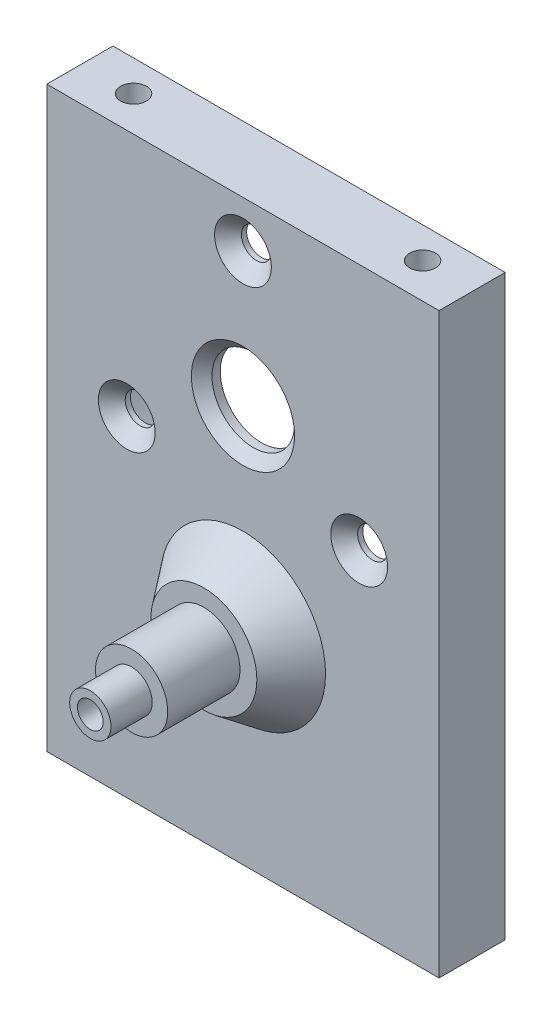
ISO-10303-21;
HEADER;
FILE_DESCRIPTION(('STEP AP214'),'2;1');
FILE_NAME('part.step','',(''),(''),'','','');
FILE_SCHEMA(('AUTOMOTIVE_DESIGN { 1 0 10303 214 1 1 1 1 }'));
ENDSEC;
DATA;
#1=APPLICATION_CONTEXT('core data for automotive mechanical design processes');
#2=APPLICATION_PROTOCOL_DEFINITION('international standard','automotive_design',2000,#1);
#3=PRODUCT_CONTEXT('',#1,'mechanical');
#4=PRODUCT('Part','Part','',(#3));
#5=PRODUCT_RELATED_PRODUCT_CATEGORY('part','',(#4));
#6=PRODUCT_DEFINITION_FORMATION('','',#4);
#7=PRODUCT_DEFINITION_CONTEXT('part definition',#1,'design');
#8=PRODUCT_DEFINITION('design','',#6,#7);
#9=PRODUCT_DEFINITION_SHAPE('','',#8);
#10=(LENGTH_UNIT() NAMED_UNIT(*) SI_UNIT(.MILLI.,.METRE.));
#11=(NAMED_UNIT(*) PLANE_ANGLE_UNIT() SI_UNIT($,.RADIAN.));
#12=(NAMED_UNIT(*) SI_UNIT($,.STERADIAN.) SOLID_ANGLE_UNIT());
#13=UNCERTAINTY_MEASURE_WITH_UNIT(LENGTH_MEASURE(1.E-05),#10,'distance_accuracy_value','');
#14=(GEOMETRIC_REPRESENTATION_CONTEXT(3) GLOBAL_UNCERTAINTY_ASSIGNED_CONTEXT((#13)) GLOBAL_UNIT_ASSIGNED_CONTEXT((#10,
#11,#12)) REPRESENTATION_CONTEXT('',''));
#15=CARTESIAN_POINT('',(0.,0.,0.));
#16=DIRECTION('',(0.,0.,1.));
#17=DIRECTION('',(1.,0.,0.));
#18=AXIS2_PLACEMENT_3D('',#15,#16,#17);
#19=CARTESIAN_POINT('',(0.,20.,17.19));
#20=DIRECTION('',(0.,0.,1.));
#21=DIRECTION('',(1.,0.,0.));
#22=AXIS2_PLACEMENT_3D('',#19,#20,#21);
#23=PLANE('',#22);
#24=CARTESIAN_POINT('',(0.,20.,17.19));
#25=DIRECTION('',(0.,0.,1.));
#26=DIRECTION('',(1.,0.,0.));
#27=AXIS2_PLACEMENT_3D('',#24,#25,#26);
#28=CIRCLE('',#27,3.5);
#29=CARTESIAN_POINT('',(3.5,20.,17.19));
#30=VERTEX_POINT('',#29);
#31=EDGE_CURVE('E118',#30,#30,#28,.T.);
#32=ORIENTED_EDGE('',*,*,#31,.T.);
#33=EDGE_LOOP('',(#32));
#34=FACE_BOUND('',#33,.T.);
#35=CARTESIAN_POINT('',(0.,20.,17.19));
#36=DIRECTION('',(0.,0.,1.));
#37=DIRECTION('',(1.,0.,0.));
#38=AXIS2_PLACEMENT_3D('',#35,#36,#37);
#39=CIRCLE('',#38,2.);
#40=CARTESIAN_POINT('',(2.,20.,17.19));
#41=VERTEX_POINT('',#40);
#42=EDGE_CURVE('E104',#41,#41,#39,.T.);
#43=ORIENTED_EDGE('',*,*,#42,.F.);
#44=EDGE_LOOP('',(#43));
#45=FACE_BOUND('',#44,.T.);
#46=ADVANCED_FACE('F41',(#34,#45),#23,.T.);
#47=CARTESIAN_POINT('',(0.,20.,10.19));
#48=DIRECTION('',(0.,0.,1.));
#49=DIRECTION('',(1.,0.,0.));
#50=AXIS2_PLACEMENT_3D('',#47,#48,#49);
#51=PLANE('',#50);
#52=CARTESIAN_POINT('',(0.,20.,10.19));
#53=DIRECTION('',(0.,0.,1.));
#54=DIRECTION('',(1.,0.,0.));
#55=AXIS2_PLACEMENT_3D('',#52,#53,#54);
#56=CIRCLE('',#55,5.13421550094521);
#57=CARTESIAN_POINT('',(5.13421550094521,20.,10.19));
#58=VERTEX_POINT('',#57);
#59=EDGE_CURVE('E183',#58,#58,#56,.T.);
#60=ORIENTED_EDGE('',*,*,#59,.T.);
#61=EDGE_LOOP('',(#60));
#62=FACE_BOUND('',#61,.T.);
#63=CARTESIAN_POINT('',(0.,20.,10.19));
#64=DIRECTION('',(0.,0.,1.));
#65=DIRECTION('',(1.,0.,0.));
#66=AXIS2_PLACEMENT_3D('',#63,#64,#65);
#67=CIRCLE('',#66,3.5);
#68=CARTESIAN_POINT('',(3.5,20.,10.19));
#69=VERTEX_POINT('',#68);
#70=EDGE_CURVE('E116',#69,#69,#67,.T.);
#71=ORIENTED_EDGE('',*,*,#70,.F.);
#72=EDGE_LOOP('',(#71));
#73=FACE_BOUND('',#72,.T.);
#74=ADVANCED_FACE('F204',(#62,#73),#51,.T.);
#75=CARTESIAN_POINT('',(0.,38.5,4.6));
#76=DIRECTION('',(0.,0.,-1.));
#77=DIRECTION('',(-1.,0.,0.));
#78=AXIS2_PLACEMENT_3D('',#75,#76,#77);
#79=PLANE('',#78);
#80=CARTESIAN_POINT('',(11.2583302491976,31.9999999999999,4.6));
#81=DIRECTION('',(0.,0.,-1.));
#82=DIRECTION('',(-1.,0.,0.));
#83=AXIS2_PLACEMENT_3D('',#80,#81,#82);
#84=CIRCLE('',#83,1.44999999999999);
#85=CARTESIAN_POINT('',(9.80833024919764,31.9999999999999,4.6));
#86=VERTEX_POINT('',#85);
#87=EDGE_CURVE('E137',#86,#86,#84,.F.);
#88=ORIENTED_EDGE('',*,*,#87,.T.);
#89=EDGE_LOOP('',(#88));
#90=FACE_BOUND('',#89,.T.);
#91=CARTESIAN_POINT('',(-11.2583302491978,32.,4.6));
#92=DIRECTION('',(0.,0.,-1.));
#93=DIRECTION('',(-1.,0.,0.));
#94=AXIS2_PLACEMENT_3D('',#91,#92,#93);
#95=CIRCLE('',#94,1.44999999999999);
#96=CARTESIAN_POINT('',(-12.7083302491978,32.,4.6));
#97=VERTEX_POINT('',#96);
#98=EDGE_CURVE('E146',#97,#97,#95,.F.);
#99=ORIENTED_EDGE('',*,*,#98,.T.);
#100=EDGE_LOOP('',(#99));
#101=FACE_BOUND('',#100,.T.);
#102=CARTESIAN_POINT('',(0.,38.5,4.6));
#103=DIRECTION('',(0.,0.,-1.));
#104=DIRECTION('',(-1.,0.,0.));
#105=AXIS2_PLACEMENT_3D('',#102,#103,#104);
#106=CIRCLE('',#105,4.00000000000001);
#107=CARTESIAN_POINT('',(-4.00000000000001,38.5,4.6));
#108=VERTEX_POINT('',#107);
#109=EDGE_CURVE('E145',#108,#108,#106,.T.);
#110=ORIENTED_EDGE('',*,*,#109,.F.);
#111=EDGE_LOOP('',(#110));
#112=FACE_BOUND('',#111,.T.);
#113=CARTESIAN_POINT('',(0.,38.5,4.6));
#114=DIRECTION('',(0.,0.,-1.));
#115=DIRECTION('',(-1.,0.,0.));
#116=AXIS2_PLACEMENT_3D('',#113,#114,#115);
#117=CIRCLE('',#116,16.54);
#118=CARTESIAN_POINT('',(-16.54,38.5,4.6));
#119=VERTEX_POINT('',#118);
#120=EDGE_CURVE('E154',#119,#119,#117,.T.);
#121=ORIENTED_EDGE('',*,*,#120,.T.);
#122=EDGE_LOOP('',(#121));
#123=FACE_BOUND('',#122,.T.);
#124=CARTESIAN_POINT('',(0.,51.5,4.6));
#125=DIRECTION('',(0.,0.,-1.));
#126=DIRECTION('',(-1.,0.,0.));
#127=AXIS2_PLACEMENT_3D('',#124,#125,#126);
#128=CIRCLE('',#127,1.44999999999999);
#129=CARTESIAN_POINT('',(-1.44999999999999,51.5,4.6));
#130=VERTEX_POINT('',#129);
#131=EDGE_CURVE('E128',#130,#130,#128,.F.);
#132=ORIENTED_EDGE('',*,*,#131,.T.);
#133=EDGE_LOOP('',(#132));
#134=FACE_BOUND('',#133,.T.);
#135=ADVANCED_FACE('F210',(#90,#101,#112,#123,#134),#79,.T.);
#136=CARTESIAN_POINT('',(19.,56.,6.4));
#137=DIRECTION('',(0.,0.,1.));
#138=DIRECTION('',(1.,0.,0.));
#139=AXIS2_PLACEMENT_3D('',#136,#137,#138);
#140=PLANE('',#139);
#141=CARTESIAN_POINT('',(0.,38.5,6.4));
#142=DIRECTION('',(0.,0.,1.));
#143=DIRECTION('',(1.,0.,0.));
#144=AXIS2_PLACEMENT_3D('',#141,#142,#143);
#145=CIRCLE('',#144,5.);
#146=CARTESIAN_POINT('',(5.,38.5,6.4));
#147=VERTEX_POINT('',#146);
#148=EDGE_CURVE('E50',#147,#147,#145,.F.);
#149=ORIENTED_EDGE('',*,*,#148,.T.);
#150=EDGE_LOOP('',(#149));
#151=FACE_BOUND('',#150,.T.);
#152=CARTESIAN_POINT('',(0.,20.,6.4));
#153=DIRECTION('',(0.,0.,1.));
#154=DIRECTION('',(1.,0.,0.));
#155=AXIS2_PLACEMENT_3D('',#152,#153,#154);
#156=CIRCLE('',#155,8.00000000000004);
#157=CARTESIAN_POINT('',(8.00000000000004,20.,6.4));
#158=VERTEX_POINT('',#157);
#159=EDGE_CURVE('E180',#158,#158,#156,.F.);
#160=ORIENTED_EDGE('',*,*,#159,.T.);
#161=EDGE_LOOP('',(#160));
#162=FACE_BOUND('',#161,.T.);
#163=CARTESIAN_POINT('',(0.,51.5,6.4));
#164=DIRECTION('',(0.,0.,1.));
#165=DIRECTION('',(1.,0.,0.));
#166=AXIS2_PLACEMENT_3D('',#163,#164,#165);
#167=CIRCLE('',#166,2.75);
#168=CARTESIAN_POINT('',(2.75,51.5,6.4));
#169=VERTEX_POINT('',#168);
#170=EDGE_CURVE('E121',#169,#169,#167,.T.);
#171=ORIENTED_EDGE('',*,*,#170,.F.);
#172=EDGE_LOOP('',(#171));
#173=FACE_BOUND('',#172,.T.);
#174=CARTESIAN_POINT('',(11.2583302491976,31.9999999999999,6.4));
#175=DIRECTION('',(0.,0.,1.));
#176=DIRECTION('',(1.,0.,0.));
#177=AXIS2_PLACEMENT_3D('',#174,#175,#176);
#178=CIRCLE('',#177,2.75);
#179=CARTESIAN_POINT('',(14.0083302491976,31.9999999999999,6.4));
#180=VERTEX_POINT('',#179);
#181=EDGE_CURVE('E127',#180,#180,#178,.T.);
#182=ORIENTED_EDGE('',*,*,#181,.F.);
#183=EDGE_LOOP('',(#182));
#184=FACE_BOUND('',#183,.T.);
#185=CARTESIAN_POINT('',(-11.2583302491978,32.,6.4));
#186=DIRECTION('',(0.,0.,1.));
#187=DIRECTION('',(1.,0.,0.));
#188=AXIS2_PLACEMENT_3D('',#185,#186,#187);
#189=CIRCLE('',#188,2.75);
#190=CARTESIAN_POINT('',(-8.50833024919783,32.,6.4));
#191=VERTEX_POINT('',#190);
#192=EDGE_CURVE('E136',#191,#191,#189,.T.);
#193=ORIENTED_EDGE('',*,*,#192,.F.);
#194=EDGE_LOOP('',(#193));
#195=FACE_BOUND('',#194,.T.);
#196=DIRECTION('',(0.,1.,0.));
#197=VECTOR('',#196,1.);
#198=CARTESIAN_POINT('',(19.,0.,6.4));
#199=LINE('',#198,#197);
#200=CARTESIAN_POINT('',(19.,0.,6.4));
#201=VERTEX_POINT('',#200);
#202=CARTESIAN_POINT('',(19.,56.,6.4));
#203=VERTEX_POINT('',#202);
#204=EDGE_CURVE('E160',#201,#203,#199,.T.);
#205=ORIENTED_EDGE('',*,*,#204,.T.);
#206=DIRECTION('',(-1.,0.,0.));
#207=VECTOR('',#206,1.);
#208=CARTESIAN_POINT('',(19.,56.,6.4));
#209=LINE('',#208,#207);
#210=CARTESIAN_POINT('',(-19.,56.,6.4));
#211=VERTEX_POINT('',#210);
#212=EDGE_CURVE('E90',#203,#211,#209,.T.);
#213=ORIENTED_EDGE('',*,*,#212,.T.);
#214=DIRECTION('',(0.,-1.,0.));
#215=VECTOR('',#214,1.);
#216=CARTESIAN_POINT('',(-19.,56.,6.4));
#217=LINE('',#216,#215);
#218=CARTESIAN_POINT('',(-19.,0.,6.4));
#219=VERTEX_POINT('',#218);
#220=EDGE_CURVE('E163',#211,#219,#217,.T.);
#221=ORIENTED_EDGE('',*,*,#220,.T.);
#222=DIRECTION('',(1.,0.,0.));
#223=VECTOR('',#222,1.);
#224=CARTESIAN_POINT('',(-19.,0.,6.4));
#225=LINE('',#224,#223);
#226=EDGE_CURVE('E58',#219,#201,#225,.T.);
#227=ORIENTED_EDGE('',*,*,#226,.T.);
#228=EDGE_LOOP('',(#205,#213,#221,#227));
#229=FACE_BOUND('',#228,.T.);
#230=ADVANCED_FACE('F188',(#151,#162,#173,#184,#195,#229),#140,.T.);
#231=CARTESIAN_POINT('',(19.,56.,0.));
#232=DIRECTION('',(0.,0.,1.));
#233=DIRECTION('',(1.,0.,0.));
#234=AXIS2_PLACEMENT_3D('',#231,#232,#233);
#235=PLANE('',#234);
#236=DIRECTION('',(0.,1.,0.));
#237=VECTOR('',#236,1.);
#238=CARTESIAN_POINT('',(19.,0.,0.));
#239=LINE('',#238,#237);
#240=CARTESIAN_POINT('',(19.,0.,0.));
#241=VERTEX_POINT('',#240);
#242=CARTESIAN_POINT('',(19.,56.,0.));
#243=VERTEX_POINT('',#242);
#244=EDGE_CURVE('E157',#241,#243,#239,.T.);
#245=ORIENTED_EDGE('',*,*,#244,.F.);
#246=DIRECTION('',(1.,0.,0.));
#247=VECTOR('',#246,1.);
#248=CARTESIAN_POINT('',(-19.,0.,0.));
#249=LINE('',#248,#247);
#250=CARTESIAN_POINT('',(-19.,0.,0.));
#251=VERTEX_POINT('',#250);
#252=EDGE_CURVE('E82',#251,#241,#249,.T.);
#253=ORIENTED_EDGE('',*,*,#252,.F.);
#254=DIRECTION('',(0.,-1.,0.));
#255=VECTOR('',#254,1.);
#256=CARTESIAN_POINT('',(-19.,56.,0.));
#257=LINE('',#256,#255);
#258=CARTESIAN_POINT('',(-19.,56.,0.));
#259=VERTEX_POINT('',#258);
#260=EDGE_CURVE('E76',#259,#251,#257,.T.);
#261=ORIENTED_EDGE('',*,*,#260,.F.);
#262=DIRECTION('',(-1.,0.,0.));
#263=VECTOR('',#262,1.);
#264=CARTESIAN_POINT('',(19.,56.,0.));
#265=LINE('',#264,#263);
#266=EDGE_CURVE('E169',#243,#259,#265,.T.);
#267=ORIENTED_EDGE('',*,*,#266,.F.);
#268=EDGE_LOOP('',(#245,#253,#261,#267));
#269=FACE_BOUND('',#268,.T.);
#270=CARTESIAN_POINT('',(0.,38.5,0.));
#271=DIRECTION('',(0.,0.,-1.));
#272=DIRECTION('',(-1.,0.,0.));
#273=AXIS2_PLACEMENT_3D('',#270,#271,#272);
#274=CIRCLE('',#273,16.54);
#275=CARTESIAN_POINT('',(-16.54,38.5,0.));
#276=VERTEX_POINT('',#275);
#277=EDGE_CURVE('E153',#276,#276,#274,.T.);
#278=ORIENTED_EDGE('',*,*,#277,.F.);
#279=EDGE_LOOP('',(#278));
#280=FACE_BOUND('',#279,.T.);
#281=ADVANCED_FACE('F260',(#269,#280),#235,.F.);
#282=CARTESIAN_POINT('',(19.,0.,6.4));
#283=DIRECTION('',(-1.,0.,0.));
#284=DIRECTION('',(0.,0.,1.));
#285=AXIS2_PLACEMENT_3D('',#282,#283,#284);
#286=PLANE('',#285);
#287=ORIENTED_EDGE('',*,*,#244,.T.);
#288=DIRECTION('',(0.,0.,-1.));
#289=VECTOR('',#288,1.);
#290=CARTESIAN_POINT('',(19.,56.,6.4));
#291=LINE('',#290,#289);
#292=EDGE_CURVE('E178',#203,#243,#291,.T.);
#293=ORIENTED_EDGE('',*,*,#292,.F.);
#294=ORIENTED_EDGE('',*,*,#204,.F.);
#295=DIRECTION('',(0.,0.,-1.));
#296=VECTOR('',#295,1.);
#297=CARTESIAN_POINT('',(19.,0.,6.4));
#298=LINE('',#297,#296);
#299=EDGE_CURVE('E166',#201,#241,#298,.T.);
#300=ORIENTED_EDGE('',*,*,#299,.T.);
#301=EDGE_LOOP('',(#287,#293,#294,#300));
#302=FACE_BOUND('',#301,.T.);
#303=ADVANCED_FACE('F263',(#302),#286,.F.);
#304=CARTESIAN_POINT('',(19.,56.,6.4));
#305=DIRECTION('',(0.,-1.,0.));
#306=DIRECTION('',(1.,0.,0.));
#307=AXIS2_PLACEMENT_3D('',#304,#305,#306);
#308=PLANE('',#307);
#309=CARTESIAN_POINT('',(-14.,56.,3.));
#310=DIRECTION('',(0.,1.,0.));
#311=DIRECTION('',(-1.,0.,0.));
#312=AXIS2_PLACEMENT_3D('',#309,#310,#311);
#313=CIRCLE('',#312,1.25);
#314=CARTESIAN_POINT('',(-15.25,56.,3.));
#315=VERTEX_POINT('',#314);
#316=EDGE_CURVE('E380',#315,#315,#313,.T.);
#317=ORIENTED_EDGE('',*,*,#316,.F.);
#318=EDGE_LOOP('',(#317));
#319=FACE_BOUND('',#318,.T.);
#320=CARTESIAN_POINT('',(14.,56.,3.));
#321=DIRECTION('',(0.,1.,0.));
#322=DIRECTION('',(1.,0.,0.));
#323=AXIS2_PLACEMENT_3D('',#320,#321,#322);
#324=CIRCLE('',#323,1.25);
#325=CARTESIAN_POINT('',(15.25,56.,3.));
#326=VERTEX_POINT('',#325);
#327=EDGE_CURVE('E358',#326,#326,#324,.T.);
#328=ORIENTED_EDGE('',*,*,#327,.F.);
#329=EDGE_LOOP('',(#328));
#330=FACE_BOUND('',#329,.T.);
#331=ORIENTED_EDGE('',*,*,#266,.T.);
#332=DIRECTION('',(0.,0.,-1.));
#333=VECTOR('',#332,1.);
#334=CARTESIAN_POINT('',(-19.,56.,6.4));
#335=LINE('',#334,#333);
#336=EDGE_CURVE('E176',#211,#259,#335,.T.);
#337=ORIENTED_EDGE('',*,*,#336,.F.);
#338=ORIENTED_EDGE('',*,*,#212,.F.);
#339=ORIENTED_EDGE('',*,*,#292,.T.);
#340=EDGE_LOOP('',(#331,#337,#338,#339));
#341=FACE_BOUND('',#340,.T.);
#342=ADVANCED_FACE('F271',(#319,#330,#341),#308,.F.);
#343=CARTESIAN_POINT('',(-19.,56.,6.4));
#344=DIRECTION('',(1.,0.,0.));
#345=DIRECTION('',(0.,0.,-1.));
#346=AXIS2_PLACEMENT_3D('',#343,#344,#345);
#347=PLANE('',#346);
#348=ORIENTED_EDGE('',*,*,#260,.T.);
#349=DIRECTION('',(0.,0.,-1.));
#350=VECTOR('',#349,1.);
#351=CARTESIAN_POINT('',(-19.,0.,6.4));
#352=LINE('',#351,#350);
#353=EDGE_CURVE('E174',#219,#251,#352,.T.);
#354=ORIENTED_EDGE('',*,*,#353,.F.);
#355=ORIENTED_EDGE('',*,*,#220,.F.);
#356=ORIENTED_EDGE('',*,*,#336,.T.);
#357=EDGE_LOOP('',(#348,#354,#355,#356));
#358=FACE_BOUND('',#357,.T.);
#359=ADVANCED_FACE('F267',(#358),#347,.F.);
#360=CARTESIAN_POINT('',(-19.,0.,6.4));
#361=DIRECTION('',(0.,1.,0.));
#362=DIRECTION('',(0.,0.,1.));
#363=AXIS2_PLACEMENT_3D('',#360,#361,#362);
#364=PLANE('',#363);
#365=CARTESIAN_POINT('',(12.,0.,3.));
#366=DIRECTION('',(0.,-1.,0.));
#367=DIRECTION('',(0.,0.,-1.));
#368=AXIS2_PLACEMENT_3D('',#365,#366,#367);
#369=CIRCLE('',#368,1.25);
#370=CARTESIAN_POINT('',(12.,0.,1.75));
#371=VERTEX_POINT('',#370);
#372=EDGE_CURVE('E359',#371,#371,#369,.T.);
#373=ORIENTED_EDGE('',*,*,#372,.F.);
#374=EDGE_LOOP('',(#373));
#375=FACE_BOUND('',#374,.T.);
#376=CARTESIAN_POINT('',(0.,0.,3.));
#377=DIRECTION('',(0.,-1.,0.));
#378=DIRECTION('',(0.,0.,-1.));
#379=AXIS2_PLACEMENT_3D('',#376,#377,#378);
#380=CIRCLE('',#379,1.25);
#381=CARTESIAN_POINT('',(0.,0.,1.75));
#382=VERTEX_POINT('',#381);
#383=EDGE_CURVE('E369',#382,#382,#380,.T.);
#384=ORIENTED_EDGE('',*,*,#383,.F.);
#385=EDGE_LOOP('',(#384));
#386=FACE_BOUND('',#385,.T.);
#387=CARTESIAN_POINT('',(-12.,0.,3.));
#388=DIRECTION('',(0.,-1.,0.));
#389=DIRECTION('',(0.,0.,1.));
#390=AXIS2_PLACEMENT_3D('',#387,#388,#389);
#391=CIRCLE('',#390,1.25);
#392=CARTESIAN_POINT('',(-12.,0.,4.25));
#393=VERTEX_POINT('',#392);
#394=EDGE_CURVE('E375',#393,#393,#391,.T.);
#395=ORIENTED_EDGE('',*,*,#394,.F.);
#396=EDGE_LOOP('',(#395));
#397=FACE_BOUND('',#396,.T.);
#398=ORIENTED_EDGE('',*,*,#252,.T.);
#399=ORIENTED_EDGE('',*,*,#299,.F.);
#400=ORIENTED_EDGE('',*,*,#226,.F.);
#401=ORIENTED_EDGE('',*,*,#353,.T.);
#402=EDGE_LOOP('',(#398,#399,#400,#401));
#403=FACE_BOUND('',#402,.T.);
#404=ADVANCED_FACE('F256',(#375,#386,#397,#403),#364,.F.);
#405=CARTESIAN_POINT('',(0.,38.5,4.6));
#406=DIRECTION('',(0.,0.,-1.));
#407=DIRECTION('',(-1.,0.,0.));
#408=AXIS2_PLACEMENT_3D('',#405,#406,#407);
#409=CYLINDRICAL_SURFACE('',#408,16.54);
#410=ORIENTED_EDGE('',*,*,#277,.T.);
#411=EDGE_LOOP('',(#410));
#412=FACE_BOUND('',#411,.T.);
#413=ORIENTED_EDGE('',*,*,#120,.F.);
#414=EDGE_LOOP('',(#413));
#415=FACE_BOUND('',#414,.T.);
#416=ADVANCED_FACE('F249',(#412,#415),#409,.F.);
#417=CARTESIAN_POINT('',(0.,38.5,6.4));
#418=DIRECTION('',(0.,0.,-1.));
#419=DIRECTION('',(-1.,0.,0.));
#420=AXIS2_PLACEMENT_3D('',#417,#418,#419);
#421=CYLINDRICAL_SURFACE('',#420,4.00000000000001);
#422=CARTESIAN_POINT('',(0.,38.5,5.40000000000001));
#423=DIRECTION('',(0.,0.,1.));
#424=DIRECTION('',(1.,0.,0.));
#425=AXIS2_PLACEMENT_3D('',#422,#423,#424);
#426=CIRCLE('',#425,4.00000000000001);
#427=CARTESIAN_POINT('',(4.00000000000001,38.5,5.40000000000001));
#428=VERTEX_POINT('',#427);
#429=EDGE_CURVE('E11',#428,#428,#426,.T.);
#430=ORIENTED_EDGE('',*,*,#429,.T.);
#431=EDGE_LOOP('',(#430));
#432=FACE_BOUND('',#431,.T.);
#433=ORIENTED_EDGE('',*,*,#109,.T.);
#434=EDGE_LOOP('',(#433));
#435=FACE_BOUND('',#434,.T.);
#436=ADVANCED_FACE('F242',(#432,#435),#421,.F.);
#437=CARTESIAN_POINT('',(-11.2583302491978,32.,6.4));
#438=DIRECTION('',(0.,0.,1.));
#439=DIRECTION('',(1.,0.,0.));
#440=AXIS2_PLACEMENT_3D('',#437,#438,#439);
#441=CYLINDRICAL_SURFACE('',#440,1.44999999999999);
#442=ORIENTED_EDGE('',*,*,#98,.F.);
#443=EDGE_LOOP('',(#442));
#444=FACE_BOUND('',#443,.T.);
#445=CARTESIAN_POINT('',(-11.2583302491978,32.,5.09999999999999));
#446=DIRECTION('',(0.,0.,1.));
#447=DIRECTION('',(1.,0.,0.));
#448=AXIS2_PLACEMENT_3D('',#445,#446,#447);
#449=CIRCLE('',#448,1.44999999999999);
#450=CARTESIAN_POINT('',(-9.80833024919784,32.,5.09999999999999));
#451=VERTEX_POINT('',#450);
#452=EDGE_CURVE('E142',#451,#451,#449,.T.);
#453=ORIENTED_EDGE('',*,*,#452,.T.);
#454=EDGE_LOOP('',(#453));
#455=FACE_BOUND('',#454,.T.);
#456=ADVANCED_FACE('F239',(#444,#455),#441,.F.);
#457=CARTESIAN_POINT('',(-11.2583302491978,32.,6.4));
#458=DIRECTION('',(0.,0.,1.));
#459=DIRECTION('',(1.,0.,0.));
#460=AXIS2_PLACEMENT_3D('',#457,#458,#459);
#461=CONICAL_SURFACE('',#460,2.75,0.785398163397448);
#462=ORIENTED_EDGE('',*,*,#452,.F.);
#463=EDGE_LOOP('',(#462));
#464=FACE_BOUND('',#463,.T.);
#465=ORIENTED_EDGE('',*,*,#192,.T.);
#466=EDGE_LOOP('',(#465));
#467=FACE_BOUND('',#466,.T.);
#468=ADVANCED_FACE('F234',(#464,#467),#461,.F.);
#469=CARTESIAN_POINT('',(11.2583302491976,31.9999999999999,6.4));
#470=DIRECTION('',(0.,0.,1.));
#471=DIRECTION('',(1.,0.,0.));
#472=AXIS2_PLACEMENT_3D('',#469,#470,#471);
#473=CYLINDRICAL_SURFACE('',#472,1.44999999999999);
#474=ORIENTED_EDGE('',*,*,#87,.F.);
#475=EDGE_LOOP('',(#474));
#476=FACE_BOUND('',#475,.T.);
#477=CARTESIAN_POINT('',(11.2583302491976,31.9999999999999,5.09999999999999));
#478=DIRECTION('',(0.,0.,1.));
#479=DIRECTION('',(1.,0.,0.));
#480=AXIS2_PLACEMENT_3D('',#477,#478,#479);
#481=CIRCLE('',#480,1.44999999999999);
#482=CARTESIAN_POINT('',(12.7083302491976,31.9999999999999,5.09999999999999));
#483=VERTEX_POINT('',#482);
#484=EDGE_CURVE('E133',#483,#483,#481,.T.);
#485=ORIENTED_EDGE('',*,*,#484,.T.);
#486=EDGE_LOOP('',(#485));
#487=FACE_BOUND('',#486,.T.);
#488=ADVANCED_FACE('F231',(#476,#487),#473,.F.);
#489=CARTESIAN_POINT('',(11.2583302491976,31.9999999999999,6.4));
#490=DIRECTION('',(0.,0.,1.));
#491=DIRECTION('',(1.,0.,0.));
#492=AXIS2_PLACEMENT_3D('',#489,#490,#491);
#493=CONICAL_SURFACE('',#492,2.75,0.785398163397448);
#494=ORIENTED_EDGE('',*,*,#484,.F.);
#495=EDGE_LOOP('',(#494));
#496=FACE_BOUND('',#495,.T.);
#497=ORIENTED_EDGE('',*,*,#181,.T.);
#498=EDGE_LOOP('',(#497));
#499=FACE_BOUND('',#498,.T.);
#500=ADVANCED_FACE('F226',(#496,#499),#493,.F.);
#501=CARTESIAN_POINT('',(0.,51.5,6.4));
#502=DIRECTION('',(0.,0.,1.));
#503=DIRECTION('',(1.,0.,0.));
#504=AXIS2_PLACEMENT_3D('',#501,#502,#503);
#505=CYLINDRICAL_SURFACE('',#504,1.44999999999999);
#506=ORIENTED_EDGE('',*,*,#131,.F.);
#507=EDGE_LOOP('',(#506));
#508=FACE_BOUND('',#507,.T.);
#509=CARTESIAN_POINT('',(0.,51.5,5.09999999999999));
#510=DIRECTION('',(0.,0.,1.));
#511=DIRECTION('',(1.,0.,0.));
#512=AXIS2_PLACEMENT_3D('',#509,#510,#511);
#513=CIRCLE('',#512,1.44999999999999);
#514=CARTESIAN_POINT('',(1.44999999999999,51.5,5.09999999999999));
#515=VERTEX_POINT('',#514);
#516=EDGE_CURVE('E124',#515,#515,#513,.T.);
#517=ORIENTED_EDGE('',*,*,#516,.T.);
#518=EDGE_LOOP('',(#517));
#519=FACE_BOUND('',#518,.T.);
#520=ADVANCED_FACE('F223',(#508,#519),#505,.F.);
#521=CARTESIAN_POINT('',(0.,51.5,6.4));
#522=DIRECTION('',(0.,0.,1.));
#523=DIRECTION('',(1.,0.,0.));
#524=AXIS2_PLACEMENT_3D('',#521,#522,#523);
#525=CONICAL_SURFACE('',#524,2.75,0.785398163397448);
#526=ORIENTED_EDGE('',*,*,#516,.F.);
#527=EDGE_LOOP('',(#526));
#528=FACE_BOUND('',#527,.T.);
#529=ORIENTED_EDGE('',*,*,#170,.T.);
#530=EDGE_LOOP('',(#529));
#531=FACE_BOUND('',#530,.T.);
#532=ADVANCED_FACE('F220',(#528,#531),#525,.F.);
#533=CARTESIAN_POINT('',(0.,20.,17.19));
#534=DIRECTION('',(0.,0.,-1.));
#535=DIRECTION('',(-1.,0.,0.));
#536=AXIS2_PLACEMENT_3D('',#533,#534,#535);
#537=CYLINDRICAL_SURFACE('',#536,3.5);
#538=ORIENTED_EDGE('',*,*,#31,.F.);
#539=EDGE_LOOP('',(#538));
#540=FACE_BOUND('',#539,.T.);
#541=ORIENTED_EDGE('',*,*,#70,.T.);
#542=EDGE_LOOP('',(#541));
#543=FACE_BOUND('',#542,.T.);
#544=ADVANCED_FACE('F218',(#540,#543),#537,.T.);
#545=CARTESIAN_POINT('',(0.,20.,21.19));
#546=DIRECTION('',(0.,0.,-1.));
#547=DIRECTION('',(-1.,0.,0.));
#548=AXIS2_PLACEMENT_3D('',#545,#546,#547);
#549=CYLINDRICAL_SURFACE('',#548,2.);
#550=CARTESIAN_POINT('',(0.,20.,21.19));
#551=DIRECTION('',(0.,0.,1.));
#552=DIRECTION('',(1.,0.,0.));
#553=AXIS2_PLACEMENT_3D('',#550,#551,#552);
#554=CIRCLE('',#553,2.);
#555=CARTESIAN_POINT('',(2.,20.,21.19));
#556=VERTEX_POINT('',#555);
#557=EDGE_CURVE('E108',#556,#556,#554,.T.);
#558=ORIENTED_EDGE('',*,*,#557,.F.);
#559=EDGE_LOOP('',(#558));
#560=FACE_BOUND('',#559,.T.);
#561=ORIENTED_EDGE('',*,*,#42,.T.);
#562=EDGE_LOOP('',(#561));
#563=FACE_BOUND('',#562,.T.);
#564=ADVANCED_FACE('F216',(#560,#563),#549,.T.);
#565=CARTESIAN_POINT('',(0.,20.,21.19));
#566=DIRECTION('',(0.,0.,1.));
#567=DIRECTION('',(1.,0.,0.));
#568=AXIS2_PLACEMENT_3D('',#565,#566,#567);
#569=PLANE('',#568);
#570=CARTESIAN_POINT('',(0.,20.,21.19));
#571=DIRECTION('',(0.,0.,1.));
#572=DIRECTION('',(1.,0.,0.));
#573=AXIS2_PLACEMENT_3D('',#570,#571,#572);
#574=CIRCLE('',#573,1.24999999999999);
#575=CARTESIAN_POINT('',(1.24999999999999,20.,21.19));
#576=VERTEX_POINT('',#575);
#577=EDGE_CURVE('E105',#576,#576,#574,.T.);
#578=ORIENTED_EDGE('',*,*,#577,.F.);
#579=EDGE_LOOP('',(#578));
#580=FACE_BOUND('',#579,.T.);
#581=ORIENTED_EDGE('',*,*,#557,.T.);
#582=EDGE_LOOP('',(#581));
#583=FACE_BOUND('',#582,.T.);
#584=ADVANCED_FACE('F278',(#580,#583),#569,.T.);
#585=CARTESIAN_POINT('',(0.,20.,11.69));
#586=DIRECTION('',(0.,0.,-1.));
#587=DIRECTION('',(-1.,0.,0.));
#588=AXIS2_PLACEMENT_3D('',#585,#586,#587);
#589=CONICAL_SURFACE('',#588,4.,0.647421474716014);
#590=ORIENTED_EDGE('',*,*,#159,.F.);
#591=EDGE_LOOP('',(#590));
#592=FACE_BOUND('',#591,.T.);
#593=ORIENTED_EDGE('',*,*,#59,.F.);
#594=EDGE_LOOP('',(#593));
#595=FACE_BOUND('',#594,.T.);
#596=ADVANCED_FACE('F98',(#592,#595),#589,.T.);
#597=CARTESIAN_POINT('',(0.,20.,11.19));
#598=DIRECTION('',(0.,0.,1.));
#599=DIRECTION('',(1.,0.,0.));
#600=AXIS2_PLACEMENT_3D('',#597,#598,#599);
#601=CONICAL_SURFACE('',#600,1.25,1.02974425867665);
#602=CARTESIAN_POINT('',(0.,20.,10.4389242262155));
#603=VERTEX_POINT('',#602);
#604=VERTEX_LOOP('',#603);
#605=FACE_BOUND('',#604,.T.);
#606=CARTESIAN_POINT('',(0.,20.,11.19));
#607=DIRECTION('',(0.,0.,1.));
#608=DIRECTION('',(1.,0.,0.));
#609=AXIS2_PLACEMENT_3D('',#606,#607,#608);
#610=CIRCLE('',#609,1.25);
#611=CARTESIAN_POINT('',(1.25,20.,11.19));
#612=VERTEX_POINT('',#611);
#613=EDGE_CURVE('E102',#612,#612,#610,.T.);
#614=ORIENTED_EDGE('',*,*,#613,.T.);
#615=EDGE_LOOP('',(#614));
#616=FACE_BOUND('',#615,.T.);
#617=ADVANCED_FACE('F94',(#605,#616),#601,.F.);
#618=CARTESIAN_POINT('',(0.,20.,21.19));
#619=DIRECTION('',(0.,0.,1.));
#620=DIRECTION('',(1.,0.,0.));
#621=AXIS2_PLACEMENT_3D('',#618,#619,#620);
#622=CYLINDRICAL_SURFACE('',#621,1.24999999999999);
#623=ORIENTED_EDGE('',*,*,#613,.F.);
#624=EDGE_LOOP('',(#623));
#625=FACE_BOUND('',#624,.T.);
#626=ORIENTED_EDGE('',*,*,#577,.T.);
#627=EDGE_LOOP('',(#626));
#628=FACE_BOUND('',#627,.T.);
#629=ADVANCED_FACE('F97',(#625,#628),#622,.F.);
#630=CARTESIAN_POINT('',(0.,38.5,6.4));
#631=DIRECTION('',(0.,0.,1.));
#632=DIRECTION('',(1.,0.,0.));
#633=AXIS2_PLACEMENT_3D('',#630,#631,#632);
#634=CONICAL_SURFACE('',#633,5.,0.785398163397448);
#635=ORIENTED_EDGE('',*,*,#429,.F.);
#636=EDGE_LOOP('',(#635));
#637=FACE_BOUND('',#636,.T.);
#638=ORIENTED_EDGE('',*,*,#148,.F.);
#639=EDGE_LOOP('',(#638));
#640=FACE_BOUND('',#639,.T.);
#641=ADVANCED_FACE('F43',(#637,#640),#634,.F.);
#642=CARTESIAN_POINT('',(14.,50.,3.));
#643=DIRECTION('',(0.,1.,0.));
#644=DIRECTION('',(-1.,0.,0.));
#645=AXIS2_PLACEMENT_3D('',#642,#643,#644);
#646=CYLINDRICAL_SURFACE('',#645,1.25);
#647=CARTESIAN_POINT('',(14.,50.,3.));
#648=DIRECTION('',(0.,1.,0.));
#649=DIRECTION('',(1.,0.,0.));
#650=AXIS2_PLACEMENT_3D('',#647,#648,#649);
#651=CIRCLE('',#650,1.25);
#652=CARTESIAN_POINT('',(15.25,50.,3.));
#653=VERTEX_POINT('',#652);
#654=EDGE_CURVE('E362',#653,#653,#651,.T.);
#655=ORIENTED_EDGE('',*,*,#654,.F.);
#656=EDGE_LOOP('',(#655));
#657=FACE_BOUND('',#656,.T.);
#658=ORIENTED_EDGE('',*,*,#327,.T.);
#659=EDGE_LOOP('',(#658));
#660=FACE_BOUND('',#659,.T.);
#661=ADVANCED_FACE('F192',(#657,#660),#646,.F.);
#662=CARTESIAN_POINT('',(14.,50.,3.));
#663=DIRECTION('',(0.,-1.,0.));
#664=DIRECTION('',(1.,0.,0.));
#665=AXIS2_PLACEMENT_3D('',#662,#663,#664);
#666=PLANE('',#665);
#667=ORIENTED_EDGE('',*,*,#654,.T.);
#668=EDGE_LOOP('',(#667));
#669=FACE_BOUND('',#668,.T.);
#670=ADVANCED_FACE('F198',(#669),#666,.F.);
#671=CARTESIAN_POINT('',(-14.,50.,3.));
#672=DIRECTION('',(0.,1.,0.));
#673=DIRECTION('',(-1.,0.,0.));
#674=AXIS2_PLACEMENT_3D('',#671,#672,#673);
#675=CYLINDRICAL_SURFACE('',#674,1.25);
#676=CARTESIAN_POINT('',(-14.,50.,3.));
#677=DIRECTION('',(0.,1.,0.));
#678=DIRECTION('',(-1.,0.,0.));
#679=AXIS2_PLACEMENT_3D('',#676,#677,#678);
#680=CIRCLE('',#679,1.25);
#681=CARTESIAN_POINT('',(-15.25,50.,3.));
#682=VERTEX_POINT('',#681);
#683=EDGE_CURVE('E111',#682,#682,#680,.T.);
#684=ORIENTED_EDGE('',*,*,#683,.F.);
#685=EDGE_LOOP('',(#684));
#686=FACE_BOUND('',#685,.T.);
#687=ORIENTED_EDGE('',*,*,#316,.T.);
#688=EDGE_LOOP('',(#687));
#689=FACE_BOUND('',#688,.T.);
#690=ADVANCED_FACE('F321',(#686,#689),#675,.F.);
#691=CARTESIAN_POINT('',(-14.,50.,3.));
#692=DIRECTION('',(0.,1.,0.));
#693=DIRECTION('',(-1.,0.,0.));
#694=AXIS2_PLACEMENT_3D('',#691,#692,#693);
#695=PLANE('',#694);
#696=ORIENTED_EDGE('',*,*,#683,.T.);
#697=EDGE_LOOP('',(#696));
#698=FACE_BOUND('',#697,.T.);
#699=ADVANCED_FACE('F325',(#698),#695,.T.);
#700=CARTESIAN_POINT('',(-12.,10.,3.));
#701=DIRECTION('',(0.,-1.,0.));
#702=DIRECTION('',(0.,0.,-1.));
#703=AXIS2_PLACEMENT_3D('',#700,#701,#702);
#704=CYLINDRICAL_SURFACE('',#703,1.25);
#705=CARTESIAN_POINT('',(-12.,10.,3.));
#706=DIRECTION('',(0.,-1.,0.));
#707=DIRECTION('',(0.,0.,1.));
#708=AXIS2_PLACEMENT_3D('',#705,#706,#707);
#709=CIRCLE('',#708,1.25);
#710=CARTESIAN_POINT('',(-12.,10.,4.25));
#711=VERTEX_POINT('',#710);
#712=EDGE_CURVE('E372',#711,#711,#709,.T.);
#713=ORIENTED_EDGE('',*,*,#712,.F.);
#714=EDGE_LOOP('',(#713));
#715=FACE_BOUND('',#714,.T.);
#716=ORIENTED_EDGE('',*,*,#394,.T.);
#717=EDGE_LOOP('',(#716));
#718=FACE_BOUND('',#717,.T.);
#719=ADVANCED_FACE('F329',(#715,#718),#704,.F.);
#720=CARTESIAN_POINT('',(-12.,10.,3.));
#721=DIRECTION('',(0.,1.,0.));
#722=DIRECTION('',(0.,0.,1.));
#723=AXIS2_PLACEMENT_3D('',#720,#721,#722);
#724=PLANE('',#723);
#725=ORIENTED_EDGE('',*,*,#712,.T.);
#726=EDGE_LOOP('',(#725));
#727=FACE_BOUND('',#726,.T.);
#728=ADVANCED_FACE('F333',(#727),#724,.F.);
#729=CARTESIAN_POINT('',(0.,10.,3.));
#730=DIRECTION('',(0.,-1.,0.));
#731=DIRECTION('',(0.,0.,-1.));
#732=AXIS2_PLACEMENT_3D('',#729,#730,#731);
#733=CYLINDRICAL_SURFACE('',#732,1.25);
#734=CARTESIAN_POINT('',(0.,10.,3.));
#735=DIRECTION('',(0.,-1.,0.));
#736=DIRECTION('',(0.,0.,-1.));
#737=AXIS2_PLACEMENT_3D('',#734,#735,#736);
#738=CIRCLE('',#737,1.25);
#739=CARTESIAN_POINT('',(0.,10.,1.75));
#740=VERTEX_POINT('',#739);
#741=EDGE_CURVE('E364',#740,#740,#738,.T.);
#742=ORIENTED_EDGE('',*,*,#741,.F.);
#743=EDGE_LOOP('',(#742));
#744=FACE_BOUND('',#743,.T.);
#745=ORIENTED_EDGE('',*,*,#383,.T.);
#746=EDGE_LOOP('',(#745));
#747=FACE_BOUND('',#746,.T.);
#748=ADVANCED_FACE('F337',(#744,#747),#733,.F.);
#749=CARTESIAN_POINT('',(0.,10.,3.));
#750=DIRECTION('',(0.,-1.,0.));
#751=DIRECTION('',(0.,0.,-1.));
#752=AXIS2_PLACEMENT_3D('',#749,#750,#751);
#753=PLANE('',#752);
#754=ORIENTED_EDGE('',*,*,#741,.T.);
#755=EDGE_LOOP('',(#754));
#756=FACE_BOUND('',#755,.T.);
#757=ADVANCED_FACE('F341',(#756),#753,.T.);
#758=CARTESIAN_POINT('',(12.,10.,3.));
#759=DIRECTION('',(0.,-1.,0.));
#760=DIRECTION('',(0.,0.,-1.));
#761=AXIS2_PLACEMENT_3D('',#758,#759,#760);
#762=CYLINDRICAL_SURFACE('',#761,1.25);
#763=CARTESIAN_POINT('',(12.,10.,3.));
#764=DIRECTION('',(0.,-1.,0.));
#765=DIRECTION('',(0.,0.,-1.));
#766=AXIS2_PLACEMENT_3D('',#763,#764,#765);
#767=CIRCLE('',#766,1.25);
#768=CARTESIAN_POINT('',(12.,10.,1.75));
#769=VERTEX_POINT('',#768);
#770=EDGE_CURVE('E357',#769,#769,#767,.T.);
#771=ORIENTED_EDGE('',*,*,#770,.F.);
#772=EDGE_LOOP('',(#771));
#773=FACE_BOUND('',#772,.T.);
#774=ORIENTED_EDGE('',*,*,#372,.T.);
#775=EDGE_LOOP('',(#774));
#776=FACE_BOUND('',#775,.T.);
#777=ADVANCED_FACE('F345',(#773,#776),#762,.F.);
#778=CARTESIAN_POINT('',(12.,10.,3.));
#779=DIRECTION('',(0.,-1.,0.));
#780=DIRECTION('',(0.,0.,-1.));
#781=AXIS2_PLACEMENT_3D('',#778,#779,#780);
#782=PLANE('',#781);
#783=ORIENTED_EDGE('',*,*,#770,.T.);
#784=EDGE_LOOP('',(#783));
#785=FACE_BOUND('',#784,.T.);
#786=ADVANCED_FACE('F349',(#785),#782,.T.);
#787=CLOSED_SHELL('',(#46,#74,#135,#230,#281,#303,#342,#359,#404,#416,#436,#456,#468,#488,#500,
#520,#532,#544,#564,#584,#596,#617,#629,#641,#661,#670,#690,#699,#719,#728,#748,#757,#777,#786));
#788=MANIFOLD_SOLID_BREP('B2',#787);
#789=ADVANCED_BREP_SHAPE_REPRESENTATION('',(#18,#788),#14);
#790=SHAPE_DEFINITION_REPRESENTATION(#9,#789);
ENDSEC;
END-ISO-10303-21;
